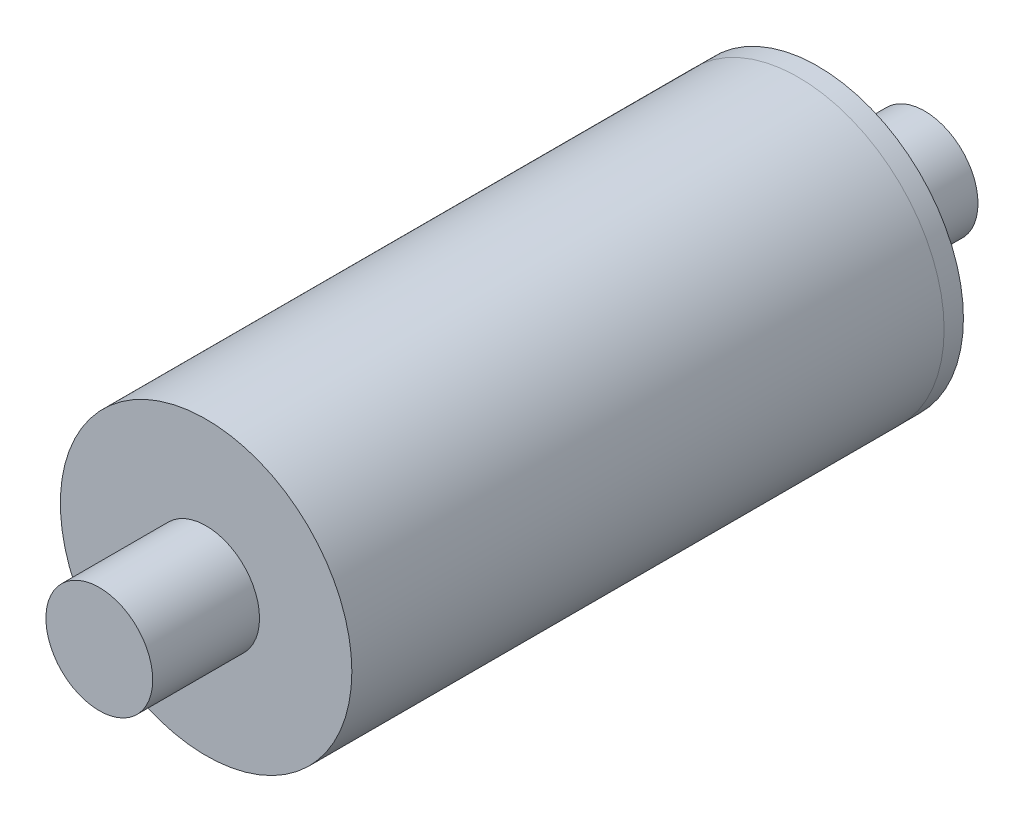
ISO-10303-21;
HEADER;
FILE_DESCRIPTION(('STEP AP214'),'2;1');
FILE_NAME('part.step','',(''),(''),'','','');
FILE_SCHEMA(('AUTOMOTIVE_DESIGN { 1 0 10303 214 1 1 1 1 }'));
ENDSEC;
DATA;
#1=APPLICATION_CONTEXT('core data for automotive mechanical design processes');
#2=APPLICATION_PROTOCOL_DEFINITION('international standard','automotive_design',2000,#1);
#3=PRODUCT_CONTEXT('',#1,'mechanical');
#4=PRODUCT('Part','Part','',(#3));
#5=PRODUCT_RELATED_PRODUCT_CATEGORY('part','',(#4));
#6=PRODUCT_DEFINITION_FORMATION('','',#4);
#7=PRODUCT_DEFINITION_CONTEXT('part definition',#1,'design');
#8=PRODUCT_DEFINITION('design','',#6,#7);
#9=PRODUCT_DEFINITION_SHAPE('','',#8);
#10=(LENGTH_UNIT() NAMED_UNIT(*) SI_UNIT(.MILLI.,.METRE.));
#11=(NAMED_UNIT(*) PLANE_ANGLE_UNIT() SI_UNIT($,.RADIAN.));
#12=(NAMED_UNIT(*) SI_UNIT($,.STERADIAN.) SOLID_ANGLE_UNIT());
#13=UNCERTAINTY_MEASURE_WITH_UNIT(LENGTH_MEASURE(1.E-05),#10,'distance_accuracy_value','');
#14=(GEOMETRIC_REPRESENTATION_CONTEXT(3) GLOBAL_UNCERTAINTY_ASSIGNED_CONTEXT((#13)) GLOBAL_UNIT_ASSIGNED_CONTEXT((#10,
#11,#12)) REPRESENTATION_CONTEXT('',''));
#15=CARTESIAN_POINT('',(0.,0.,0.));
#16=DIRECTION('',(0.,0.,1.));
#17=DIRECTION('',(1.,0.,0.));
#18=AXIS2_PLACEMENT_3D('',#15,#16,#17);
#19=CARTESIAN_POINT('',(0.700759493670886,-0.350379746835443,11.));
#20=DIRECTION('',(0.,0.,-1.));
#21=DIRECTION('',(-1.,0.,0.));
#22=AXIS2_PLACEMENT_3D('',#19,#20,#21);
#23=CYLINDRICAL_SURFACE('',#22,5.5);
#24=CARTESIAN_POINT('',(0.700759493670886,-0.350379746835443,11.));
#25=DIRECTION('',(0.,0.,1.));
#26=DIRECTION('',(1.,0.,0.));
#27=AXIS2_PLACEMENT_3D('',#24,#25,#26);
#28=CIRCLE('',#27,5.5);
#29=CARTESIAN_POINT('',(6.20075949367089,-0.350379746835443,11.));
#30=VERTEX_POINT('',#29);
#31=EDGE_CURVE('E126',#30,#30,#28,.T.);
#32=ORIENTED_EDGE('',*,*,#31,.F.);
#33=EDGE_LOOP('',(#32));
#34=FACE_BOUND('',#33,.T.);
#35=CARTESIAN_POINT('',(0.700759493670886,-0.350379746835443,0.));
#36=DIRECTION('',(0.,0.,1.));
#37=DIRECTION('',(1.,0.,0.));
#38=AXIS2_PLACEMENT_3D('',#35,#36,#37);
#39=CIRCLE('',#38,5.5);
#40=CARTESIAN_POINT('',(6.20075949367089,-0.350379746835443,0.));
#41=VERTEX_POINT('',#40);
#42=EDGE_CURVE('E123',#41,#41,#39,.T.);
#43=ORIENTED_EDGE('',*,*,#42,.T.);
#44=EDGE_LOOP('',(#43));
#45=FACE_BOUND('',#44,.T.);
#46=ADVANCED_FACE('F40',(#34,#45),#23,.T.);
#47=CARTESIAN_POINT('',(0.700759493670886,-0.350379746835443,0.));
#48=DIRECTION('',(0.,0.,1.));
#49=DIRECTION('',(1.,0.,0.));
#50=AXIS2_PLACEMENT_3D('',#47,#48,#49);
#51=PLANE('',#50);
#52=CARTESIAN_POINT('',(0.700759493670893,-0.350379746835437,0.));
#53=DIRECTION('',(0.,0.,1.));
#54=DIRECTION('',(1.,0.,0.));
#55=AXIS2_PLACEMENT_3D('',#52,#53,#54);
#56=CIRCLE('',#55,2.65);
#57=CARTESIAN_POINT('',(0.788092045177833,-2.9989403040905,0.));
#58=VERTEX_POINT('',#57);
#59=CARTESIAN_POINT('',(3.33876196161989,-0.602258644512511,0.));
#60=VERTEX_POINT('',#59);
#61=EDGE_CURVE('E48',#58,#60,#56,.T.);
#62=ORIENTED_EDGE('',*,*,#61,.T.);
#63=DIRECTION('',(-0.684766188450854,0.728762833269157,0.));
#64=VECTOR('',#63,1.);
#65=CARTESIAN_POINT('',(0.613426942163953,2.29818081041963,0.));
#66=LINE('',#65,#64);
#67=CARTESIAN_POINT('',(0.613426942163953,2.29818081041963,0.));
#68=VERTEX_POINT('',#67);
#69=EDGE_CURVE('E94',#60,#68,#66,.T.);
#70=ORIENTED_EDGE('',*,*,#69,.T.);
#71=CARTESIAN_POINT('',(-1.9372429742781,-0.0985008491583596,0.));
#72=VERTEX_POINT('',#71);
#73=EDGE_CURVE('E11',#68,#72,#56,.T.);
#74=ORIENTED_EDGE('',*,*,#73,.T.);
#75=DIRECTION('',(0.684766188450854,-0.728762833269157,0.));
#76=VECTOR('',#75,1.);
#77=CARTESIAN_POINT('',(-1.9372429742781,-0.0985008491583596,0.));
#78=LINE('',#77,#76);
#79=EDGE_CURVE('E89',#72,#58,#78,.T.);
#80=ORIENTED_EDGE('',*,*,#79,.T.);
#81=EDGE_LOOP('',(#62,#70,#74,#80));
#82=FACE_BOUND('',#81,.T.);
#83=ORIENTED_EDGE('',*,*,#42,.F.);
#84=EDGE_LOOP('',(#83));
#85=FACE_BOUND('',#84,.T.);
#86=ADVANCED_FACE('F157',(#82,#85),#51,.F.);
#87=CARTESIAN_POINT('',(0.700759493670886,-0.350379746835443,13.));
#88=DIRECTION('',(0.,0.,-1.));
#89=DIRECTION('',(-1.,0.,0.));
#90=AXIS2_PLACEMENT_3D('',#87,#88,#89);
#91=CYLINDRICAL_SURFACE('',#90,15.);
#92=CARTESIAN_POINT('',(0.700759493670886,-0.350379746835443,13.));
#93=DIRECTION('',(0.,0.,1.));
#94=DIRECTION('',(1.,0.,0.));
#95=AXIS2_PLACEMENT_3D('',#92,#93,#94);
#96=CIRCLE('',#95,15.);
#97=CARTESIAN_POINT('',(15.7007594936709,-0.350379746835443,13.));
#98=VERTEX_POINT('',#97);
#99=EDGE_CURVE('E120',#98,#98,#96,.T.);
#100=ORIENTED_EDGE('',*,*,#99,.F.);
#101=EDGE_LOOP('',(#100));
#102=FACE_BOUND('',#101,.T.);
#103=CARTESIAN_POINT('',(0.700759493670886,-0.350379746835443,11.));
#104=DIRECTION('',(0.,0.,1.));
#105=DIRECTION('',(1.,0.,0.));
#106=AXIS2_PLACEMENT_3D('',#103,#104,#105);
#107=CIRCLE('',#106,15.);
#108=CARTESIAN_POINT('',(15.7007594936709,-0.350379746835443,11.));
#109=VERTEX_POINT('',#108);
#110=EDGE_CURVE('E119',#109,#109,#107,.T.);
#111=ORIENTED_EDGE('',*,*,#110,.T.);
#112=EDGE_LOOP('',(#111));
#113=FACE_BOUND('',#112,.T.);
#114=ADVANCED_FACE('F154',(#102,#113),#91,.T.);
#115=CARTESIAN_POINT('',(0.700759493670886,-0.350379746835443,11.));
#116=DIRECTION('',(0.,0.,1.));
#117=DIRECTION('',(1.,0.,0.));
#118=AXIS2_PLACEMENT_3D('',#115,#116,#117);
#119=PLANE('',#118);
#120=ORIENTED_EDGE('',*,*,#31,.T.);
#121=EDGE_LOOP('',(#120));
#122=FACE_BOUND('',#121,.T.);
#123=ORIENTED_EDGE('',*,*,#110,.F.);
#124=EDGE_LOOP('',(#123));
#125=FACE_BOUND('',#124,.T.);
#126=ADVANCED_FACE('F150',(#122,#125),#119,.F.);
#127=CARTESIAN_POINT('',(0.700759493670886,-0.350379746835443,13.));
#128=DIRECTION('',(0.,0.,1.));
#129=DIRECTION('',(1.,0.,0.));
#130=AXIS2_PLACEMENT_3D('',#127,#128,#129);
#131=PLANE('',#130);
#132=ORIENTED_EDGE('',*,*,#99,.T.);
#133=EDGE_LOOP('',(#132));
#134=FACE_BOUND('',#133,.T.);
#135=CARTESIAN_POINT('',(0.700759493670886,-0.350379746835443,13.));
#136=DIRECTION('',(0.,0.,1.));
#137=DIRECTION('',(1.,0.,0.));
#138=AXIS2_PLACEMENT_3D('',#135,#136,#137);
#139=CIRCLE('',#138,15.0110760528858);
#140=CARTESIAN_POINT('',(15.7118355465567,-0.350379746835443,13.));
#141=VERTEX_POINT('',#140);
#142=EDGE_CURVE('E116',#141,#141,#139,.T.);
#143=ORIENTED_EDGE('',*,*,#142,.F.);
#144=EDGE_LOOP('',(#143));
#145=FACE_BOUND('',#144,.T.);
#146=ADVANCED_FACE('F153',(#134,#145),#131,.F.);
#147=CARTESIAN_POINT('',(0.700759493670886,-0.350379746835443,72.));
#148=DIRECTION('',(0.,0.,-1.));
#149=DIRECTION('',(-1.,0.,0.));
#150=AXIS2_PLACEMENT_3D('',#147,#148,#149);
#151=CYLINDRICAL_SURFACE('',#150,15.0110760528858);
#152=ORIENTED_EDGE('',*,*,#142,.T.);
#153=EDGE_LOOP('',(#152));
#154=FACE_BOUND('',#153,.T.);
#155=CARTESIAN_POINT('',(0.700759493670886,-0.350379746835443,74.));
#156=DIRECTION('',(0.,0.,1.));
#157=DIRECTION('',(1.,0.,0.));
#158=AXIS2_PLACEMENT_3D('',#155,#156,#157);
#159=CIRCLE('',#158,15.0110760528858);
#160=CARTESIAN_POINT('',(15.7118355465567,-0.350379746835443,74.));
#161=VERTEX_POINT('',#160);
#162=EDGE_CURVE('E110',#161,#161,#159,.T.);
#163=ORIENTED_EDGE('',*,*,#162,.F.);
#164=EDGE_LOOP('',(#163));
#165=FACE_BOUND('',#164,.T.);
#166=ADVANCED_FACE('F148',(#154,#165),#151,.T.);
#167=CARTESIAN_POINT('',(0.700759493670886,-0.350379746835443,74.));
#168=DIRECTION('',(0.,0.,1.));
#169=DIRECTION('',(1.,0.,0.));
#170=AXIS2_PLACEMENT_3D('',#167,#168,#169);
#171=PLANE('',#170);
#172=CARTESIAN_POINT('',(0.700759493670886,-0.350379746835443,74.));
#173=DIRECTION('',(0.,0.,1.));
#174=DIRECTION('',(1.,0.,0.));
#175=AXIS2_PLACEMENT_3D('',#172,#173,#174);
#176=CIRCLE('',#175,5.5);
#177=CARTESIAN_POINT('',(6.20075949367089,-0.350379746835443,74.));
#178=VERTEX_POINT('',#177);
#179=EDGE_CURVE('E104',#178,#178,#176,.T.);
#180=ORIENTED_EDGE('',*,*,#179,.F.);
#181=EDGE_LOOP('',(#180));
#182=FACE_BOUND('',#181,.T.);
#183=ORIENTED_EDGE('',*,*,#162,.T.);
#184=EDGE_LOOP('',(#183));
#185=FACE_BOUND('',#184,.T.);
#186=ADVANCED_FACE('F195',(#182,#185),#171,.T.);
#187=CARTESIAN_POINT('',(0.700759493670886,-0.350379746835443,74.));
#188=DIRECTION('',(0.,0.,1.));
#189=DIRECTION('',(1.,0.,0.));
#190=AXIS2_PLACEMENT_3D('',#187,#188,#189);
#191=CYLINDRICAL_SURFACE('',#190,5.5);
#192=ORIENTED_EDGE('',*,*,#179,.T.);
#193=EDGE_LOOP('',(#192));
#194=FACE_BOUND('',#193,.T.);
#195=CARTESIAN_POINT('',(0.700759493670886,-0.350379746835443,85.));
#196=DIRECTION('',(0.,0.,1.));
#197=DIRECTION('',(1.,0.,0.));
#198=AXIS2_PLACEMENT_3D('',#195,#196,#197);
#199=CIRCLE('',#198,5.5);
#200=CARTESIAN_POINT('',(6.20075949367089,-0.350379746835443,85.));
#201=VERTEX_POINT('',#200);
#202=EDGE_CURVE('E99',#201,#201,#199,.T.);
#203=ORIENTED_EDGE('',*,*,#202,.F.);
#204=EDGE_LOOP('',(#203));
#205=FACE_BOUND('',#204,.T.);
#206=ADVANCED_FACE('F187',(#194,#205),#191,.T.);
#207=CARTESIAN_POINT('',(0.700759493670886,-0.350379746835443,85.));
#208=DIRECTION('',(0.,0.,-1.));
#209=DIRECTION('',(1.,0.,0.));
#210=AXIS2_PLACEMENT_3D('',#207,#208,#209);
#211=PLANE('',#210);
#212=ORIENTED_EDGE('',*,*,#202,.T.);
#213=EDGE_LOOP('',(#212));
#214=FACE_BOUND('',#213,.T.);
#215=ADVANCED_FACE('F181',(#214),#211,.F.);
#216=CARTESIAN_POINT('',(0.700759493670893,-0.350379746835437,-45.0953318805774));
#217=DIRECTION('',(0.,0.,1.));
#218=DIRECTION('',(0.684766188450854,-0.728762833269157,0.));
#219=AXIS2_PLACEMENT_3D('',#216,#217,#218);
#220=CYLINDRICAL_SURFACE('',#219,2.65);
#221=DIRECTION('',(0.,0.,1.));
#222=VECTOR('',#221,1.);
#223=CARTESIAN_POINT('',(0.613426942163953,2.29818081041963,-5.08044115262065));
#224=LINE('',#223,#222);
#225=CARTESIAN_POINT('',(0.613426942163953,2.29818081041963,7.99999999999998));
#226=VERTEX_POINT('',#225);
#227=EDGE_CURVE('E55',#68,#226,#224,.T.);
#228=ORIENTED_EDGE('',*,*,#227,.T.);
#229=CARTESIAN_POINT('',(0.700759493670893,-0.350379746835437,7.99999999999998));
#230=DIRECTION('',(0.,0.,1.));
#231=DIRECTION('',(0.684766188450854,-0.728762833269157,0.));
#232=AXIS2_PLACEMENT_3D('',#229,#230,#231);
#233=CIRCLE('',#232,2.65);
#234=CARTESIAN_POINT('',(-1.9372429742781,-0.0985008491583596,7.99999999999998));
#235=VERTEX_POINT('',#234);
#236=EDGE_CURVE('E88',#226,#235,#233,.T.);
#237=ORIENTED_EDGE('',*,*,#236,.T.);
#238=DIRECTION('',(0.,0.,1.));
#239=VECTOR('',#238,1.);
#240=CARTESIAN_POINT('',(-1.9372429742781,-0.0985008491583596,-5.08044115262065));
#241=LINE('',#240,#239);
#242=EDGE_CURVE('E174',#72,#235,#241,.T.);
#243=ORIENTED_EDGE('',*,*,#242,.F.);
#244=ORIENTED_EDGE('',*,*,#73,.F.);
#245=EDGE_LOOP('',(#228,#237,#243,#244));
#246=FACE_BOUND('',#245,.T.);
#247=ADVANCED_FACE('F179',(#246),#220,.F.);
#248=DIRECTION('',(0.,0.,1.));
#249=VECTOR('',#248,1.);
#250=CARTESIAN_POINT('',(0.788092045177833,-2.9989403040905,-5.08044115262065));
#251=LINE('',#250,#249);
#252=CARTESIAN_POINT('',(0.788092045177836,-2.99894030409051,7.99999999999998));
#253=VERTEX_POINT('',#252);
#254=EDGE_CURVE('E63',#58,#253,#251,.T.);
#255=ORIENTED_EDGE('',*,*,#254,.T.);
#256=CARTESIAN_POINT('',(3.33876196161989,-0.602258644512511,7.99999999999998));
#257=VERTEX_POINT('',#256);
#258=EDGE_CURVE('E86',#253,#257,#233,.T.);
#259=ORIENTED_EDGE('',*,*,#258,.T.);
#260=DIRECTION('',(0.,0.,1.));
#261=VECTOR('',#260,1.);
#262=CARTESIAN_POINT('',(3.33876196161989,-0.602258644512511,-5.08044115262065));
#263=LINE('',#262,#261);
#264=EDGE_CURVE('E91',#60,#257,#263,.T.);
#265=ORIENTED_EDGE('',*,*,#264,.F.);
#266=ORIENTED_EDGE('',*,*,#61,.F.);
#267=EDGE_LOOP('',(#255,#259,#265,#266));
#268=FACE_BOUND('',#267,.T.);
#269=ADVANCED_FACE('F97',(#268),#220,.F.);
#270=CARTESIAN_POINT('',(0.700759493670893,-0.350379746835437,7.99999999999998));
#271=DIRECTION('',(0.,0.,1.));
#272=DIRECTION('',(0.684766188450854,-0.728762833269157,0.));
#273=AXIS2_PLACEMENT_3D('',#270,#271,#272);
#274=PLANE('',#273);
#275=DIRECTION('',(0.684766188450854,-0.728762833269157,0.));
#276=VECTOR('',#275,1.);
#277=CARTESIAN_POINT('',(0.613426942163953,2.29818081041963,7.99999999999998));
#278=LINE('',#277,#276);
#279=EDGE_CURVE('E83',#226,#257,#278,.T.);
#280=ORIENTED_EDGE('',*,*,#279,.T.);
#281=ORIENTED_EDGE('',*,*,#258,.F.);
#282=DIRECTION('',(-0.684766188450854,0.728762833269157,0.));
#283=VECTOR('',#282,1.);
#284=CARTESIAN_POINT('',(-1.9372429742781,-0.0985008491583596,7.99999999999998));
#285=LINE('',#284,#283);
#286=EDGE_CURVE('E173',#253,#235,#285,.T.);
#287=ORIENTED_EDGE('',*,*,#286,.T.);
#288=ORIENTED_EDGE('',*,*,#236,.F.);
#289=EDGE_LOOP('',(#280,#281,#287,#288));
#290=FACE_BOUND('',#289,.T.);
#291=ADVANCED_FACE('F85',(#290),#274,.F.);
#292=CARTESIAN_POINT('',(-1.9372429742781,-0.0985008491583596,-5.08044115262065));
#293=DIRECTION('',(0.728762833269157,0.684766188450854,0.));
#294=DIRECTION('',(0.,0.,1.));
#295=AXIS2_PLACEMENT_3D('',#292,#293,#294);
#296=PLANE('',#295);
#297=ORIENTED_EDGE('',*,*,#79,.F.);
#298=ORIENTED_EDGE('',*,*,#242,.T.);
#299=ORIENTED_EDGE('',*,*,#286,.F.);
#300=ORIENTED_EDGE('',*,*,#254,.F.);
#301=EDGE_LOOP('',(#297,#298,#299,#300));
#302=FACE_BOUND('',#301,.T.);
#303=ADVANCED_FACE('F171',(#302),#296,.T.);
#304=CARTESIAN_POINT('',(0.613426942163953,2.29818081041963,-5.08044115262065));
#305=DIRECTION('',(-0.728762833269157,-0.684766188450854,0.));
#306=DIRECTION('',(0.,0.,-1.));
#307=AXIS2_PLACEMENT_3D('',#304,#305,#306);
#308=PLANE('',#307);
#309=ORIENTED_EDGE('',*,*,#69,.F.);
#310=ORIENTED_EDGE('',*,*,#264,.T.);
#311=ORIENTED_EDGE('',*,*,#279,.F.);
#312=ORIENTED_EDGE('',*,*,#227,.F.);
#313=EDGE_LOOP('',(#309,#310,#311,#312));
#314=FACE_BOUND('',#313,.T.);
#315=ADVANCED_FACE('F92',(#314),#308,.T.);
#316=CLOSED_SHELL('',(#46,#86,#114,#126,#146,#166,#186,#206,#215,#247,#269,#291,#303,#315));
#317=CARTESIAN_POINT('',(0.700759493670886,-0.350379746835443,13.));
#318=DIRECTION('',(0.,0.,1.));
#319=DIRECTION('',(1.,0.,0.));
#320=AXIS2_PLACEMENT_3D('',#317,#318,#319);
#321=PLANE('',#320);
#322=CARTESIAN_POINT('',(0.700759493670886,-0.350379746835443,13.));
#323=DIRECTION('',(0.,0.,1.));
#324=DIRECTION('',(1.,0.,0.));
#325=AXIS2_PLACEMENT_3D('',#322,#323,#324);
#326=CIRCLE('',#325,13.0110760528858);
#327=CARTESIAN_POINT('',(13.7118355465567,-0.350379746835443,13.));
#328=VERTEX_POINT('',#327);
#329=EDGE_CURVE('E107',#328,#328,#326,.F.);
#330=ORIENTED_EDGE('',*,*,#329,.F.);
#331=EDGE_LOOP('',(#330));
#332=FACE_BOUND('',#331,.T.);
#333=ADVANCED_FACE('F135',(#332),#321,.T.);
#334=CARTESIAN_POINT('',(0.700759493670886,-0.350379746835443,72.));
#335=DIRECTION('',(0.,0.,-1.));
#336=DIRECTION('',(-1.,0.,0.));
#337=AXIS2_PLACEMENT_3D('',#334,#335,#336);
#338=CYLINDRICAL_SURFACE('',#337,13.0110760528858);
#339=CARTESIAN_POINT('',(0.700759493670886,-0.350379746835443,72.));
#340=DIRECTION('',(0.,0.,1.));
#341=DIRECTION('',(1.,0.,0.));
#342=AXIS2_PLACEMENT_3D('',#339,#340,#341);
#343=CIRCLE('',#342,13.0110760528858);
#344=CARTESIAN_POINT('',(13.7118355465567,-0.350379746835443,72.));
#345=VERTEX_POINT('',#344);
#346=EDGE_CURVE('E113',#345,#345,#343,.T.);
#347=ORIENTED_EDGE('',*,*,#346,.T.);
#348=EDGE_LOOP('',(#347));
#349=FACE_BOUND('',#348,.T.);
#350=ORIENTED_EDGE('',*,*,#329,.T.);
#351=EDGE_LOOP('',(#350));
#352=FACE_BOUND('',#351,.T.);
#353=ADVANCED_FACE('F133',(#349,#352),#338,.F.);
#354=CARTESIAN_POINT('',(0.700759493670886,-0.350379746835443,72.));
#355=DIRECTION('',(0.,0.,1.));
#356=DIRECTION('',(1.,0.,0.));
#357=AXIS2_PLACEMENT_3D('',#354,#355,#356);
#358=PLANE('',#357);
#359=ORIENTED_EDGE('',*,*,#346,.F.);
#360=EDGE_LOOP('',(#359));
#361=FACE_BOUND('',#360,.T.);
#362=ADVANCED_FACE('F143',(#361),#358,.F.);
#363=CLOSED_SHELL('',(#333,#353,#362));
#364=ORIENTED_CLOSED_SHELL('',*,#363,.T.);
#365=BREP_WITH_VOIDS('B2',#316,(#364));
#366=ADVANCED_BREP_SHAPE_REPRESENTATION('',(#18,#365),#14);
#367=SHAPE_DEFINITION_REPRESENTATION(#9,#366);
ENDSEC;
END-ISO-10303-21;
